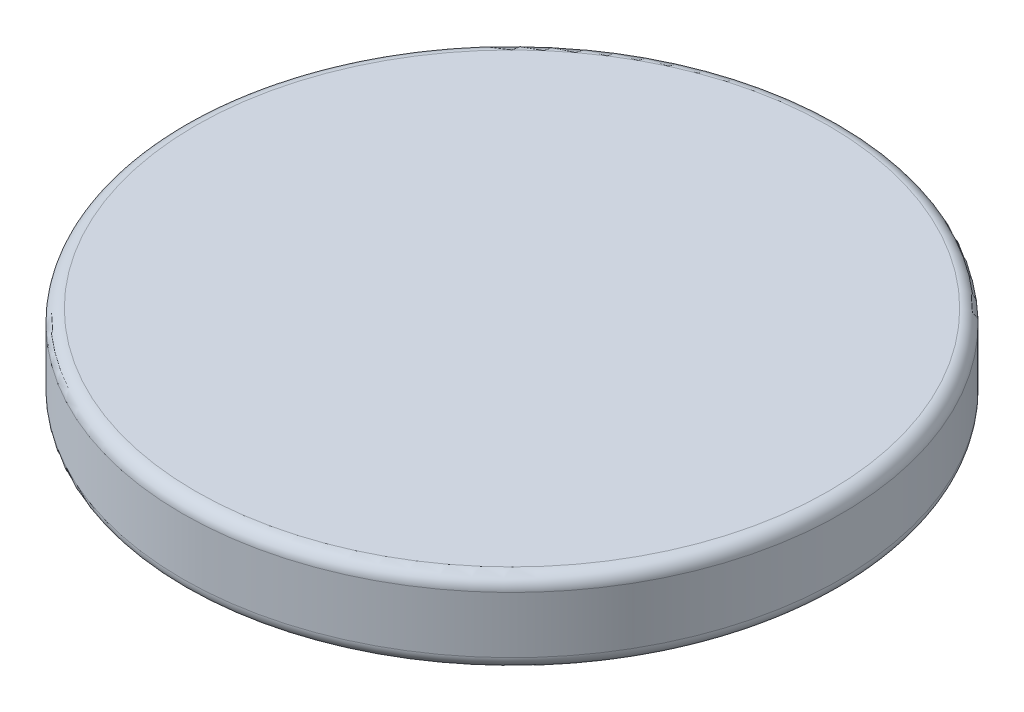
ISO-10303-21;
HEADER;
FILE_DESCRIPTION(('STEP AP214'),'2;1');
FILE_NAME('part.step','',(''),(''),'','','');
FILE_SCHEMA(('AUTOMOTIVE_DESIGN { 1 0 10303 214 1 1 1 1 }'));
ENDSEC;
DATA;
#1=APPLICATION_CONTEXT('core data for automotive mechanical design processes');
#2=APPLICATION_PROTOCOL_DEFINITION('international standard','automotive_design',2000,#1);
#3=PRODUCT_CONTEXT('',#1,'mechanical');
#4=PRODUCT('Part','Part','',(#3));
#5=PRODUCT_RELATED_PRODUCT_CATEGORY('part','',(#4));
#6=PRODUCT_DEFINITION_FORMATION('','',#4);
#7=PRODUCT_DEFINITION_CONTEXT('part definition',#1,'design');
#8=PRODUCT_DEFINITION('design','',#6,#7);
#9=PRODUCT_DEFINITION_SHAPE('','',#8);
#10=(LENGTH_UNIT() NAMED_UNIT(*) SI_UNIT(.MILLI.,.METRE.));
#11=(NAMED_UNIT(*) PLANE_ANGLE_UNIT() SI_UNIT($,.RADIAN.));
#12=(NAMED_UNIT(*) SI_UNIT($,.STERADIAN.) SOLID_ANGLE_UNIT());
#13=UNCERTAINTY_MEASURE_WITH_UNIT(LENGTH_MEASURE(1.E-05),#10,'distance_accuracy_value','');
#14=(GEOMETRIC_REPRESENTATION_CONTEXT(3) GLOBAL_UNCERTAINTY_ASSIGNED_CONTEXT((#13)) GLOBAL_UNIT_ASSIGNED_CONTEXT((#10,
#11,#12)) REPRESENTATION_CONTEXT('',''));
#15=CARTESIAN_POINT('',(0.,0.,0.));
#16=DIRECTION('',(0.,0.,1.));
#17=DIRECTION('',(1.,0.,0.));
#18=AXIS2_PLACEMENT_3D('',#15,#16,#17);
#19=CARTESIAN_POINT('',(0.,1.5875,0.));
#20=DIRECTION('',(0.,-1.,0.));
#21=DIRECTION('',(0.,0.,-1.));
#22=AXIS2_PLACEMENT_3D('',#19,#20,#21);
#23=CYLINDRICAL_SURFACE('',#22,6.35);
#24=CARTESIAN_POINT('',(0.,0.25,0.));
#25=DIRECTION('',(0.,1.,0.));
#26=DIRECTION('',(0.,0.,1.));
#27=AXIS2_PLACEMENT_3D('',#24,#25,#26);
#28=CIRCLE('',#27,6.35);
#29=CARTESIAN_POINT('',(0.,0.25,6.35));
#30=VERTEX_POINT('',#29);
#31=EDGE_CURVE('E42',#30,#30,#28,.T.);
#32=ORIENTED_EDGE('',*,*,#31,.T.);
#33=EDGE_LOOP('',(#32));
#34=FACE_BOUND('',#33,.T.);
#35=CARTESIAN_POINT('',(0.,1.3375,0.));
#36=DIRECTION('',(0.,1.,0.));
#37=DIRECTION('',(0.,0.,1.));
#38=AXIS2_PLACEMENT_3D('',#35,#36,#37);
#39=CIRCLE('',#38,6.35);
#40=CARTESIAN_POINT('',(0.,1.3375,6.35));
#41=VERTEX_POINT('',#40);
#42=EDGE_CURVE('E46',#41,#41,#39,.F.);
#43=ORIENTED_EDGE('',*,*,#42,.T.);
#44=EDGE_LOOP('',(#43));
#45=FACE_BOUND('',#44,.T.);
#46=ADVANCED_FACE('F31',(#34,#45),#23,.T.);
#47=CARTESIAN_POINT('',(0.,1.5875,0.));
#48=DIRECTION('',(0.,1.,0.));
#49=DIRECTION('',(0.,0.,1.));
#50=AXIS2_PLACEMENT_3D('',#47,#48,#49);
#51=PLANE('',#50);
#52=CARTESIAN_POINT('',(0.,1.5875,0.));
#53=DIRECTION('',(0.,1.,0.));
#54=DIRECTION('',(0.,0.,1.));
#55=AXIS2_PLACEMENT_3D('',#52,#53,#54);
#56=CIRCLE('',#55,6.1);
#57=CARTESIAN_POINT('',(0.,1.5875,6.1));
#58=VERTEX_POINT('',#57);
#59=EDGE_CURVE('E10',#58,#58,#56,.T.);
#60=ORIENTED_EDGE('',*,*,#59,.T.);
#61=EDGE_LOOP('',(#60));
#62=FACE_BOUND('',#61,.T.);
#63=ADVANCED_FACE('F62',(#62),#51,.T.);
#64=CARTESIAN_POINT('',(0.,0.,0.));
#65=DIRECTION('',(0.,1.,0.));
#66=DIRECTION('',(0.,0.,1.));
#67=AXIS2_PLACEMENT_3D('',#64,#65,#66);
#68=PLANE('',#67);
#69=CARTESIAN_POINT('',(0.,0.,0.));
#70=DIRECTION('',(0.,1.,0.));
#71=DIRECTION('',(0.,0.,1.));
#72=AXIS2_PLACEMENT_3D('',#69,#70,#71);
#73=CIRCLE('',#72,6.1);
#74=CARTESIAN_POINT('',(0.,0.,6.1));
#75=VERTEX_POINT('',#74);
#76=EDGE_CURVE('E38',#75,#75,#73,.F.);
#77=ORIENTED_EDGE('',*,*,#76,.T.);
#78=EDGE_LOOP('',(#77));
#79=FACE_BOUND('',#78,.T.);
#80=ADVANCED_FACE('F59',(#79),#68,.F.);
#81=CARTESIAN_POINT('',(0.,0.25,0.));
#82=DIRECTION('',(0.,1.,0.));
#83=DIRECTION('',(0.,0.,1.));
#84=AXIS2_PLACEMENT_3D('',#81,#82,#83);
#85=TOROIDAL_SURFACE('',#84,6.1,0.25);
#86=ORIENTED_EDGE('',*,*,#76,.F.);
#87=EDGE_LOOP('',(#86));
#88=FACE_BOUND('',#87,.T.);
#89=ORIENTED_EDGE('',*,*,#31,.F.);
#90=EDGE_LOOP('',(#89));
#91=FACE_BOUND('',#90,.T.);
#92=ADVANCED_FACE('F55',(#88,#91),#85,.T.);
#93=CARTESIAN_POINT('',(0.,1.3375,0.));
#94=DIRECTION('',(0.,1.,0.));
#95=DIRECTION('',(0.,0.,1.));
#96=AXIS2_PLACEMENT_3D('',#93,#94,#95);
#97=TOROIDAL_SURFACE('',#96,6.1,0.25);
#98=ORIENTED_EDGE('',*,*,#42,.F.);
#99=EDGE_LOOP('',(#98));
#100=FACE_BOUND('',#99,.T.);
#101=ORIENTED_EDGE('',*,*,#59,.F.);
#102=EDGE_LOOP('',(#101));
#103=FACE_BOUND('',#102,.T.);
#104=ADVANCED_FACE('F33',(#100,#103),#97,.T.);
#105=CLOSED_SHELL('',(#46,#63,#80,#92,#104));
#106=MANIFOLD_SOLID_BREP('B2',#105);
#107=ADVANCED_BREP_SHAPE_REPRESENTATION('',(#18,#106),#14);
#108=SHAPE_DEFINITION_REPRESENTATION(#9,#107);
ENDSEC;
END-ISO-10303-21;
